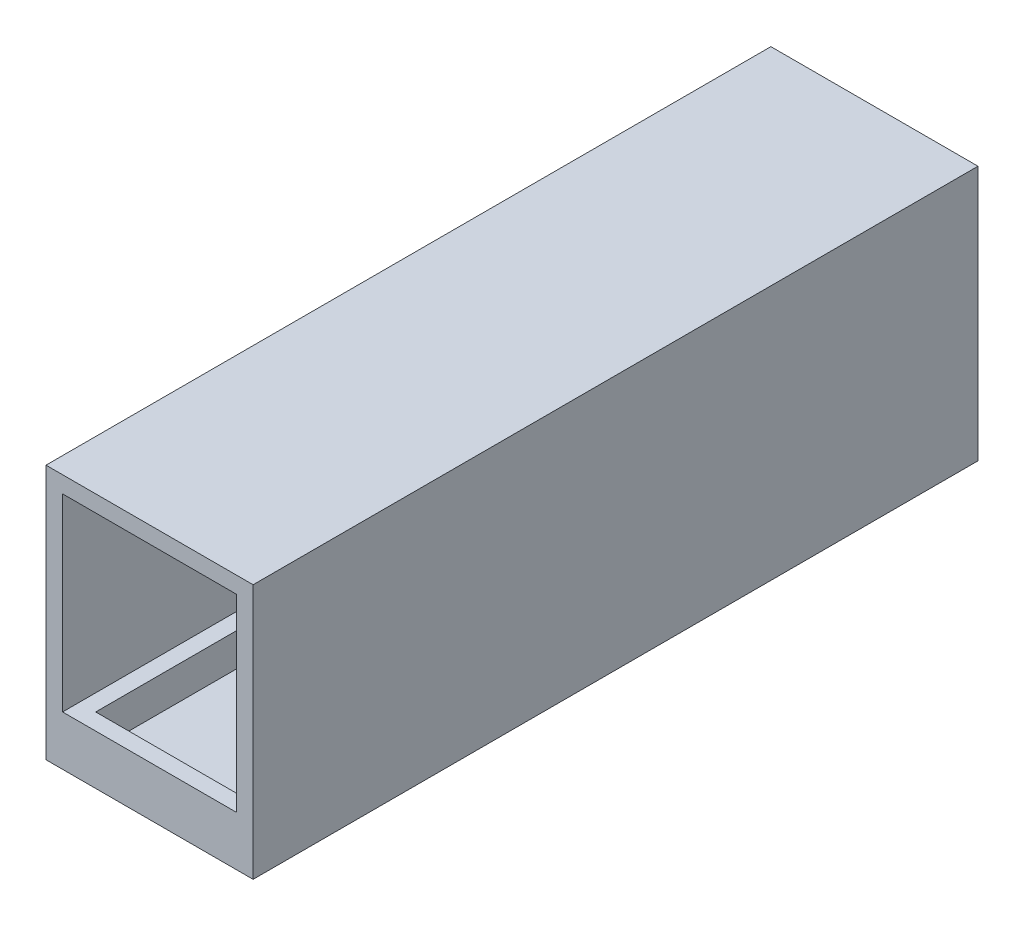
ISO-10303-21;
HEADER;
FILE_DESCRIPTION(('STEP AP214'),'2;1');
FILE_NAME('part.step','',(''),(''),'','','');
FILE_SCHEMA(('AUTOMOTIVE_DESIGN { 1 0 10303 214 1 1 1 1 }'));
ENDSEC;
DATA;
#1=APPLICATION_CONTEXT('core data for automotive mechanical design processes');
#2=APPLICATION_PROTOCOL_DEFINITION('international standard','automotive_design',2000,#1);
#3=PRODUCT_CONTEXT('',#1,'mechanical');
#4=PRODUCT('Part','Part','',(#3));
#5=PRODUCT_RELATED_PRODUCT_CATEGORY('part','',(#4));
#6=PRODUCT_DEFINITION_FORMATION('','',#4);
#7=PRODUCT_DEFINITION_CONTEXT('part definition',#1,'design');
#8=PRODUCT_DEFINITION('design','',#6,#7);
#9=PRODUCT_DEFINITION_SHAPE('','',#8);
#10=(LENGTH_UNIT() NAMED_UNIT(*) SI_UNIT(.MILLI.,.METRE.));
#11=(NAMED_UNIT(*) PLANE_ANGLE_UNIT() SI_UNIT($,.RADIAN.));
#12=(NAMED_UNIT(*) SI_UNIT($,.STERADIAN.) SOLID_ANGLE_UNIT());
#13=UNCERTAINTY_MEASURE_WITH_UNIT(LENGTH_MEASURE(1.E-05),#10,'distance_accuracy_value','');
#14=(GEOMETRIC_REPRESENTATION_CONTEXT(3) GLOBAL_UNCERTAINTY_ASSIGNED_CONTEXT((#13)) GLOBAL_UNIT_ASSIGNED_CONTEXT((#10,
#11,#12)) REPRESENTATION_CONTEXT('',''));
#15=CARTESIAN_POINT('',(0.,0.,0.));
#16=DIRECTION('',(0.,0.,1.));
#17=DIRECTION('',(1.,0.,0.));
#18=AXIS2_PLACEMENT_3D('',#15,#16,#17);
#19=CARTESIAN_POINT('',(0.,12.7,-188.9125));
#20=DIRECTION('',(0.,0.,-1.));
#21=DIRECTION('',(-1.,0.,0.));
#22=AXIS2_PLACEMENT_3D('',#19,#20,#21);
#23=PLANE('',#22);
#24=DIRECTION('',(0.,1.,0.));
#25=VECTOR('',#24,1.);
#26=CARTESIAN_POINT('',(39.6875,-6.34999999999999,-188.9125));
#27=LINE('',#26,#25);
#28=CARTESIAN_POINT('',(39.6875,-6.34999999999999,-188.9125));
#29=VERTEX_POINT('',#28);
#30=CARTESIAN_POINT('',(39.6875,91.44,-188.9125));
#31=VERTEX_POINT('',#30);
#32=EDGE_CURVE('E219',#29,#31,#27,.T.);
#33=ORIENTED_EDGE('',*,*,#32,.F.);
#34=DIRECTION('',(1.,0.,0.));
#35=VECTOR('',#34,1.);
#36=CARTESIAN_POINT('',(-33.3375,-6.35,-188.9125));
#37=LINE('',#36,#35);
#38=CARTESIAN_POINT('',(-39.6875,-6.35,-188.9125));
#39=VERTEX_POINT('',#38);
#40=EDGE_CURVE('E155',#39,#29,#37,.T.);
#41=ORIENTED_EDGE('',*,*,#40,.F.);
#42=DIRECTION('',(0.,-1.,0.));
#43=VECTOR('',#42,1.);
#44=CARTESIAN_POINT('',(-39.6875,-6.35,-188.9125));
#45=LINE('',#44,#43);
#46=CARTESIAN_POINT('',(-39.6875,91.44,-188.9125));
#47=VERTEX_POINT('',#46);
#48=EDGE_CURVE('E227',#47,#39,#45,.T.);
#49=ORIENTED_EDGE('',*,*,#48,.F.);
#50=DIRECTION('',(-1.,0.,0.));
#51=VECTOR('',#50,1.);
#52=CARTESIAN_POINT('',(-39.6875,91.44,-188.9125));
#53=LINE('',#52,#51);
#54=EDGE_CURVE('E223',#31,#47,#53,.T.);
#55=ORIENTED_EDGE('',*,*,#54,.F.);
#56=EDGE_LOOP('',(#33,#41,#49,#55));
#57=FACE_BOUND('',#56,.T.);
#58=DIRECTION('',(1.,0.,0.));
#59=VECTOR('',#58,1.);
#60=CARTESIAN_POINT('',(0.,12.7,-188.9125));
#61=LINE('',#60,#59);
#62=CARTESIAN_POINT('',(-33.3375,12.7,-188.9125));
#63=VERTEX_POINT('',#62);
#64=CARTESIAN_POINT('',(33.3375,12.7,-188.9125));
#65=VERTEX_POINT('',#64);
#66=EDGE_CURVE('E143',#63,#65,#61,.T.);
#67=ORIENTED_EDGE('',*,*,#66,.T.);
#68=DIRECTION('',(0.,-1.,0.));
#69=VECTOR('',#68,1.);
#70=CARTESIAN_POINT('',(33.3375,85.09,-188.9125));
#71=LINE('',#70,#69);
#72=CARTESIAN_POINT('',(33.3375,85.09,-188.9125));
#73=VERTEX_POINT('',#72);
#74=EDGE_CURVE('E215',#73,#65,#71,.T.);
#75=ORIENTED_EDGE('',*,*,#74,.F.);
#76=DIRECTION('',(1.,0.,0.));
#77=VECTOR('',#76,1.);
#78=CARTESIAN_POINT('',(-33.3375,85.09,-188.9125));
#79=LINE('',#78,#77);
#80=CARTESIAN_POINT('',(-33.3375,85.09,-188.9125));
#81=VERTEX_POINT('',#80);
#82=EDGE_CURVE('E210',#81,#73,#79,.T.);
#83=ORIENTED_EDGE('',*,*,#82,.F.);
#84=DIRECTION('',(0.,1.,0.));
#85=VECTOR('',#84,1.);
#86=CARTESIAN_POINT('',(-33.3375,-6.35,-188.9125));
#87=LINE('',#86,#85);
#88=EDGE_CURVE('E211',#63,#81,#87,.T.);
#89=ORIENTED_EDGE('',*,*,#88,.F.);
#90=EDGE_LOOP('',(#67,#75,#83,#89));
#91=FACE_BOUND('',#90,.T.);
#92=ADVANCED_FACE('F33',(#57,#91),#23,.T.);
#93=CARTESIAN_POINT('',(26.9875,12.7,0.));
#94=DIRECTION('',(-1.,0.,0.));
#95=DIRECTION('',(0.,0.,1.));
#96=AXIS2_PLACEMENT_3D('',#93,#94,#95);
#97=PLANE('',#96);
#98=DIRECTION('',(0.,0.,-1.));
#99=VECTOR('',#98,1.);
#100=CARTESIAN_POINT('',(26.9875,0.,0.));
#101=LINE('',#100,#99);
#102=CARTESIAN_POINT('',(26.9875,0.,-88.9));
#103=VERTEX_POINT('',#102);
#104=CARTESIAN_POINT('',(26.9875,0.,-182.5625));
#105=VERTEX_POINT('',#104);
#106=EDGE_CURVE('E163',#103,#105,#101,.T.);
#107=ORIENTED_EDGE('',*,*,#106,.F.);
#108=DIRECTION('',(0.,-1.,0.));
#109=VECTOR('',#108,1.);
#110=CARTESIAN_POINT('',(26.9875,12.7,-88.9));
#111=LINE('',#110,#109);
#112=CARTESIAN_POINT('',(26.9875,12.7,-88.9));
#113=VERTEX_POINT('',#112);
#114=EDGE_CURVE('E11',#113,#103,#111,.T.);
#115=ORIENTED_EDGE('',*,*,#114,.F.);
#116=DIRECTION('',(0.,0.,-1.));
#117=VECTOR('',#116,1.);
#118=CARTESIAN_POINT('',(26.9875,12.7,0.));
#119=LINE('',#118,#117);
#120=CARTESIAN_POINT('',(26.9875,12.7,-182.5625));
#121=VERTEX_POINT('',#120);
#122=EDGE_CURVE('E120',#113,#121,#119,.T.);
#123=ORIENTED_EDGE('',*,*,#122,.T.);
#124=DIRECTION('',(0.,-1.,0.));
#125=VECTOR('',#124,1.);
#126=CARTESIAN_POINT('',(26.9875,12.7,-182.5625));
#127=LINE('',#126,#125);
#128=EDGE_CURVE('E85',#121,#105,#127,.T.);
#129=ORIENTED_EDGE('',*,*,#128,.T.);
#130=EDGE_LOOP('',(#107,#115,#123,#129));
#131=FACE_BOUND('',#130,.T.);
#132=ADVANCED_FACE('F131',(#131),#97,.T.);
#133=CARTESIAN_POINT('',(0.,12.7,-88.9));
#134=DIRECTION('',(0.,0.,-1.));
#135=DIRECTION('',(-1.,0.,0.));
#136=AXIS2_PLACEMENT_3D('',#133,#134,#135);
#137=PLANE('',#136);
#138=DIRECTION('',(1.,0.,0.));
#139=VECTOR('',#138,1.);
#140=CARTESIAN_POINT('',(0.,0.,-88.9));
#141=LINE('',#140,#139);
#142=CARTESIAN_POINT('',(-26.9875,0.,-88.9));
#143=VERTEX_POINT('',#142);
#144=EDGE_CURVE('E165',#143,#103,#141,.T.);
#145=ORIENTED_EDGE('',*,*,#144,.F.);
#146=DIRECTION('',(0.,-1.,0.));
#147=VECTOR('',#146,1.);
#148=CARTESIAN_POINT('',(-26.9875,12.7,-88.9));
#149=LINE('',#148,#147);
#150=CARTESIAN_POINT('',(-26.9875,12.7,-88.9));
#151=VERTEX_POINT('',#150);
#152=EDGE_CURVE('E43',#151,#143,#149,.T.);
#153=ORIENTED_EDGE('',*,*,#152,.F.);
#154=DIRECTION('',(1.,0.,0.));
#155=VECTOR('',#154,1.);
#156=CARTESIAN_POINT('',(0.,12.7,-88.9));
#157=LINE('',#156,#155);
#158=EDGE_CURVE('E132',#151,#113,#157,.T.);
#159=ORIENTED_EDGE('',*,*,#158,.T.);
#160=ORIENTED_EDGE('',*,*,#114,.T.);
#161=EDGE_LOOP('',(#145,#153,#159,#160));
#162=FACE_BOUND('',#161,.T.);
#163=ADVANCED_FACE('F337',(#162),#137,.T.);
#164=CARTESIAN_POINT('',(-26.9875,12.7,0.));
#165=DIRECTION('',(-1.,0.,0.));
#166=DIRECTION('',(0.,0.,1.));
#167=AXIS2_PLACEMENT_3D('',#164,#165,#166);
#168=PLANE('',#167);
#169=DIRECTION('',(0.,0.,-1.));
#170=VECTOR('',#169,1.);
#171=CARTESIAN_POINT('',(-26.9875,0.,0.));
#172=LINE('',#171,#170);
#173=CARTESIAN_POINT('',(-26.9875,0.,-182.5625));
#174=VERTEX_POINT('',#173);
#175=EDGE_CURVE('E168',#143,#174,#172,.T.);
#176=ORIENTED_EDGE('',*,*,#175,.T.);
#177=DIRECTION('',(0.,-1.,0.));
#178=VECTOR('',#177,1.);
#179=CARTESIAN_POINT('',(-26.9875,12.7,-182.5625));
#180=LINE('',#179,#178);
#181=CARTESIAN_POINT('',(-26.9875,12.7,-182.5625));
#182=VERTEX_POINT('',#181);
#183=EDGE_CURVE('E77',#182,#174,#180,.T.);
#184=ORIENTED_EDGE('',*,*,#183,.F.);
#185=DIRECTION('',(0.,0.,-1.));
#186=VECTOR('',#185,1.);
#187=CARTESIAN_POINT('',(-26.9875,12.7,0.));
#188=LINE('',#187,#186);
#189=EDGE_CURVE('E123',#151,#182,#188,.T.);
#190=ORIENTED_EDGE('',*,*,#189,.F.);
#191=ORIENTED_EDGE('',*,*,#152,.T.);
#192=EDGE_LOOP('',(#176,#184,#190,#191));
#193=FACE_BOUND('',#192,.T.);
#194=ADVANCED_FACE('F341',(#193),#168,.F.);
#195=CARTESIAN_POINT('',(26.9875,12.7,0.));
#196=DIRECTION('',(-1.,0.,0.));
#197=DIRECTION('',(0.,0.,1.));
#198=AXIS2_PLACEMENT_3D('',#195,#196,#197);
#199=PLANE('',#198);
#200=DIRECTION('',(0.,0.,-1.));
#201=VECTOR('',#200,1.);
#202=CARTESIAN_POINT('',(26.9875,0.,0.));
#203=LINE('',#202,#201);
#204=CARTESIAN_POINT('',(26.9875,0.,82.55));
#205=VERTEX_POINT('',#204);
#206=CARTESIAN_POINT('',(26.9875,0.,-82.55));
#207=VERTEX_POINT('',#206);
#208=EDGE_CURVE('E151',#205,#207,#203,.T.);
#209=ORIENTED_EDGE('',*,*,#208,.F.);
#210=DIRECTION('',(0.,-1.,0.));
#211=VECTOR('',#210,1.);
#212=CARTESIAN_POINT('',(26.9875,12.7,82.55));
#213=LINE('',#212,#211);
#214=CARTESIAN_POINT('',(26.9875,12.7,82.55));
#215=VERTEX_POINT('',#214);
#216=EDGE_CURVE('E37',#215,#205,#213,.T.);
#217=ORIENTED_EDGE('',*,*,#216,.F.);
#218=DIRECTION('',(0.,0.,-1.));
#219=VECTOR('',#218,1.);
#220=CARTESIAN_POINT('',(26.9875,12.7,0.));
#221=LINE('',#220,#219);
#222=CARTESIAN_POINT('',(26.9875,12.7,-82.55));
#223=VERTEX_POINT('',#222);
#224=EDGE_CURVE('E170',#215,#223,#221,.T.);
#225=ORIENTED_EDGE('',*,*,#224,.T.);
#226=DIRECTION('',(0.,-1.,0.));
#227=VECTOR('',#226,1.);
#228=CARTESIAN_POINT('',(26.9875,12.7,-82.55));
#229=LINE('',#228,#227);
#230=EDGE_CURVE('E150',#223,#207,#229,.T.);
#231=ORIENTED_EDGE('',*,*,#230,.T.);
#232=EDGE_LOOP('',(#209,#217,#225,#231));
#233=FACE_BOUND('',#232,.T.);
#234=ADVANCED_FACE('F35',(#233),#199,.T.);
#235=CARTESIAN_POINT('',(0.,12.7,82.55));
#236=DIRECTION('',(0.,0.,-1.));
#237=DIRECTION('',(-1.,0.,0.));
#238=AXIS2_PLACEMENT_3D('',#235,#236,#237);
#239=PLANE('',#238);
#240=DIRECTION('',(1.,0.,0.));
#241=VECTOR('',#240,1.);
#242=CARTESIAN_POINT('',(0.,0.,82.55));
#243=LINE('',#242,#241);
#244=CARTESIAN_POINT('',(-26.9875,0.,82.55));
#245=VERTEX_POINT('',#244);
#246=EDGE_CURVE('E154',#245,#205,#243,.T.);
#247=ORIENTED_EDGE('',*,*,#246,.F.);
#248=DIRECTION('',(0.,-1.,0.));
#249=VECTOR('',#248,1.);
#250=CARTESIAN_POINT('',(-26.9875,12.7,82.55));
#251=LINE('',#250,#249);
#252=CARTESIAN_POINT('',(-26.9875,12.7,82.55));
#253=VERTEX_POINT('',#252);
#254=EDGE_CURVE('E177',#253,#245,#251,.T.);
#255=ORIENTED_EDGE('',*,*,#254,.F.);
#256=DIRECTION('',(1.,0.,0.));
#257=VECTOR('',#256,1.);
#258=CARTESIAN_POINT('',(0.,12.7,82.55));
#259=LINE('',#258,#257);
#260=EDGE_CURVE('E186',#253,#215,#259,.T.);
#261=ORIENTED_EDGE('',*,*,#260,.T.);
#262=ORIENTED_EDGE('',*,*,#216,.T.);
#263=EDGE_LOOP('',(#247,#255,#261,#262));
#264=FACE_BOUND('',#263,.T.);
#265=ADVANCED_FACE('F183',(#264),#239,.T.);
#266=CARTESIAN_POINT('',(-26.9875,12.7,0.));
#267=DIRECTION('',(-1.,0.,0.));
#268=DIRECTION('',(0.,0.,1.));
#269=AXIS2_PLACEMENT_3D('',#266,#267,#268);
#270=PLANE('',#269);
#271=DIRECTION('',(0.,0.,-1.));
#272=VECTOR('',#271,1.);
#273=CARTESIAN_POINT('',(-26.9875,0.,0.));
#274=LINE('',#273,#272);
#275=CARTESIAN_POINT('',(-26.9875,0.,-82.55));
#276=VERTEX_POINT('',#275);
#277=EDGE_CURVE('E158',#245,#276,#274,.T.);
#278=ORIENTED_EDGE('',*,*,#277,.T.);
#279=DIRECTION('',(0.,-1.,0.));
#280=VECTOR('',#279,1.);
#281=CARTESIAN_POINT('',(-26.9875,12.7,-82.55));
#282=LINE('',#281,#280);
#283=CARTESIAN_POINT('',(-26.9875,12.7,-82.55));
#284=VERTEX_POINT('',#283);
#285=EDGE_CURVE('E175',#284,#276,#282,.T.);
#286=ORIENTED_EDGE('',*,*,#285,.F.);
#287=DIRECTION('',(0.,0.,-1.));
#288=VECTOR('',#287,1.);
#289=CARTESIAN_POINT('',(-26.9875,12.7,0.));
#290=LINE('',#289,#288);
#291=EDGE_CURVE('E136',#253,#284,#290,.T.);
#292=ORIENTED_EDGE('',*,*,#291,.F.);
#293=ORIENTED_EDGE('',*,*,#254,.T.);
#294=EDGE_LOOP('',(#278,#286,#292,#293));
#295=FACE_BOUND('',#294,.T.);
#296=ADVANCED_FACE('F192',(#295),#270,.F.);
#297=CARTESIAN_POINT('',(0.,12.7,-182.5625));
#298=DIRECTION('',(0.,0.,-1.));
#299=DIRECTION('',(-1.,0.,0.));
#300=AXIS2_PLACEMENT_3D('',#297,#298,#299);
#301=PLANE('',#300);
#302=DIRECTION('',(1.,0.,0.));
#303=VECTOR('',#302,1.);
#304=CARTESIAN_POINT('',(0.,0.,-182.5625));
#305=LINE('',#304,#303);
#306=EDGE_CURVE('E128',#174,#105,#305,.T.);
#307=ORIENTED_EDGE('',*,*,#306,.T.);
#308=ORIENTED_EDGE('',*,*,#128,.F.);
#309=DIRECTION('',(1.,0.,0.));
#310=VECTOR('',#309,1.);
#311=CARTESIAN_POINT('',(0.,12.7,-182.5625));
#312=LINE('',#311,#310);
#313=EDGE_CURVE('E116',#182,#121,#312,.T.);
#314=ORIENTED_EDGE('',*,*,#313,.F.);
#315=ORIENTED_EDGE('',*,*,#183,.T.);
#316=EDGE_LOOP('',(#307,#308,#314,#315));
#317=FACE_BOUND('',#316,.T.);
#318=ADVANCED_FACE('F126',(#317),#301,.F.);
#319=CARTESIAN_POINT('',(0.,12.7,-82.55));
#320=DIRECTION('',(0.,0.,-1.));
#321=DIRECTION('',(-1.,0.,0.));
#322=AXIS2_PLACEMENT_3D('',#319,#320,#321);
#323=PLANE('',#322);
#324=DIRECTION('',(1.,0.,0.));
#325=VECTOR('',#324,1.);
#326=CARTESIAN_POINT('',(0.,0.,-82.55));
#327=LINE('',#326,#325);
#328=EDGE_CURVE('E160',#276,#207,#327,.T.);
#329=ORIENTED_EDGE('',*,*,#328,.T.);
#330=ORIENTED_EDGE('',*,*,#230,.F.);
#331=DIRECTION('',(1.,0.,0.));
#332=VECTOR('',#331,1.);
#333=CARTESIAN_POINT('',(0.,12.7,-82.55));
#334=LINE('',#333,#332);
#335=EDGE_CURVE('E133',#284,#223,#334,.T.);
#336=ORIENTED_EDGE('',*,*,#335,.F.);
#337=ORIENTED_EDGE('',*,*,#285,.T.);
#338=EDGE_LOOP('',(#329,#330,#336,#337));
#339=FACE_BOUND('',#338,.T.);
#340=ADVANCED_FACE('F195',(#339),#323,.F.);
#341=CARTESIAN_POINT('',(0.,12.7,88.9));
#342=DIRECTION('',(0.,0.,-1.));
#343=DIRECTION('',(-1.,0.,0.));
#344=AXIS2_PLACEMENT_3D('',#341,#342,#343);
#345=PLANE('',#344);
#346=DIRECTION('',(0.,-1.,0.));
#347=VECTOR('',#346,1.);
#348=CARTESIAN_POINT('',(-39.6875,-6.35,88.9));
#349=LINE('',#348,#347);
#350=CARTESIAN_POINT('',(-39.6875,91.44,88.9));
#351=VERTEX_POINT('',#350);
#352=CARTESIAN_POINT('',(-39.6875,-6.35,88.9));
#353=VERTEX_POINT('',#352);
#354=EDGE_CURVE('E242',#351,#353,#349,.T.);
#355=ORIENTED_EDGE('',*,*,#354,.T.);
#356=DIRECTION('',(1.,0.,0.));
#357=VECTOR('',#356,1.);
#358=CARTESIAN_POINT('',(-33.3375,-6.35,88.9));
#359=LINE('',#358,#357);
#360=CARTESIAN_POINT('',(39.6875,-6.34999999999999,88.9));
#361=VERTEX_POINT('',#360);
#362=EDGE_CURVE('E203',#353,#361,#359,.T.);
#363=ORIENTED_EDGE('',*,*,#362,.T.);
#364=DIRECTION('',(0.,1.,0.));
#365=VECTOR('',#364,1.);
#366=CARTESIAN_POINT('',(39.6875,-6.34999999999999,88.9));
#367=LINE('',#366,#365);
#368=CARTESIAN_POINT('',(39.6875,91.44,88.9));
#369=VERTEX_POINT('',#368);
#370=EDGE_CURVE('E251',#361,#369,#367,.T.);
#371=ORIENTED_EDGE('',*,*,#370,.T.);
#372=DIRECTION('',(-1.,0.,0.));
#373=VECTOR('',#372,1.);
#374=CARTESIAN_POINT('',(-39.6875,91.44,88.9));
#375=LINE('',#374,#373);
#376=EDGE_CURVE('E254',#369,#351,#375,.T.);
#377=ORIENTED_EDGE('',*,*,#376,.T.);
#378=EDGE_LOOP('',(#355,#363,#371,#377));
#379=FACE_BOUND('',#378,.T.);
#380=DIRECTION('',(1.,0.,0.));
#381=VECTOR('',#380,1.);
#382=CARTESIAN_POINT('',(0.,12.7,88.9));
#383=LINE('',#382,#381);
#384=CARTESIAN_POINT('',(-33.3375,12.7,88.9));
#385=VERTEX_POINT('',#384);
#386=CARTESIAN_POINT('',(33.3375,12.7,88.9));
#387=VERTEX_POINT('',#386);
#388=EDGE_CURVE('E52',#385,#387,#383,.T.);
#389=ORIENTED_EDGE('',*,*,#388,.F.);
#390=DIRECTION('',(0.,1.,0.));
#391=VECTOR('',#390,1.);
#392=CARTESIAN_POINT('',(-33.3375,-6.35,88.9));
#393=LINE('',#392,#391);
#394=CARTESIAN_POINT('',(-33.3375,85.09,88.9));
#395=VERTEX_POINT('',#394);
#396=EDGE_CURVE('E243',#385,#395,#393,.T.);
#397=ORIENTED_EDGE('',*,*,#396,.T.);
#398=DIRECTION('',(1.,0.,0.));
#399=VECTOR('',#398,1.);
#400=CARTESIAN_POINT('',(-33.3375,85.09,88.9));
#401=LINE('',#400,#399);
#402=CARTESIAN_POINT('',(33.3375,85.09,88.9));
#403=VERTEX_POINT('',#402);
#404=EDGE_CURVE('E245',#395,#403,#401,.T.);
#405=ORIENTED_EDGE('',*,*,#404,.T.);
#406=DIRECTION('',(0.,-1.,0.));
#407=VECTOR('',#406,1.);
#408=CARTESIAN_POINT('',(33.3375,85.09,88.9));
#409=LINE('',#408,#407);
#410=EDGE_CURVE('E249',#403,#387,#409,.T.);
#411=ORIENTED_EDGE('',*,*,#410,.T.);
#412=EDGE_LOOP('',(#389,#397,#405,#411));
#413=FACE_BOUND('',#412,.T.);
#414=ADVANCED_FACE('F303',(#379,#413),#345,.F.);
#415=CARTESIAN_POINT('',(0.,12.7,0.));
#416=DIRECTION('',(0.,1.,0.));
#417=DIRECTION('',(0.,0.,1.));
#418=AXIS2_PLACEMENT_3D('',#415,#416,#417);
#419=PLANE('',#418);
#420=ORIENTED_EDGE('',*,*,#224,.F.);
#421=ORIENTED_EDGE('',*,*,#260,.F.);
#422=ORIENTED_EDGE('',*,*,#291,.T.);
#423=ORIENTED_EDGE('',*,*,#335,.T.);
#424=EDGE_LOOP('',(#420,#421,#422,#423));
#425=FACE_BOUND('',#424,.T.);
#426=ORIENTED_EDGE('',*,*,#122,.F.);
#427=ORIENTED_EDGE('',*,*,#158,.F.);
#428=ORIENTED_EDGE('',*,*,#189,.T.);
#429=ORIENTED_EDGE('',*,*,#313,.T.);
#430=EDGE_LOOP('',(#426,#427,#428,#429));
#431=FACE_BOUND('',#430,.T.);
#432=DIRECTION('',(0.,0.,-1.));
#433=VECTOR('',#432,1.);
#434=CARTESIAN_POINT('',(33.3375,12.7,0.));
#435=LINE('',#434,#433);
#436=EDGE_CURVE('E124',#387,#65,#435,.T.);
#437=ORIENTED_EDGE('',*,*,#436,.T.);
#438=ORIENTED_EDGE('',*,*,#66,.F.);
#439=DIRECTION('',(0.,0.,-1.));
#440=VECTOR('',#439,1.);
#441=CARTESIAN_POINT('',(-33.3375,12.7,0.));
#442=LINE('',#441,#440);
#443=EDGE_CURVE('E146',#385,#63,#442,.T.);
#444=ORIENTED_EDGE('',*,*,#443,.F.);
#445=ORIENTED_EDGE('',*,*,#388,.T.);
#446=EDGE_LOOP('',(#437,#438,#444,#445));
#447=FACE_BOUND('',#446,.T.);
#448=ADVANCED_FACE('F117',(#425,#431,#447),#419,.T.);
#449=CARTESIAN_POINT('',(-33.3375,0.,-255.889198373389));
#450=DIRECTION('',(0.,1.,0.));
#451=DIRECTION('',(0.,0.,1.));
#452=AXIS2_PLACEMENT_3D('',#449,#450,#451);
#453=PLANE('',#452);
#454=ORIENTED_EDGE('',*,*,#144,.T.);
#455=ORIENTED_EDGE('',*,*,#106,.T.);
#456=ORIENTED_EDGE('',*,*,#306,.F.);
#457=ORIENTED_EDGE('',*,*,#175,.F.);
#458=EDGE_LOOP('',(#454,#455,#456,#457));
#459=FACE_BOUND('',#458,.T.);
#460=ADVANCED_FACE('F339',(#459),#453,.T.);
#461=ORIENTED_EDGE('',*,*,#246,.T.);
#462=ORIENTED_EDGE('',*,*,#208,.T.);
#463=ORIENTED_EDGE('',*,*,#328,.F.);
#464=ORIENTED_EDGE('',*,*,#277,.F.);
#465=EDGE_LOOP('',(#461,#462,#463,#464));
#466=FACE_BOUND('',#465,.T.);
#467=ADVANCED_FACE('F189',(#466),#453,.T.);
#468=CARTESIAN_POINT('',(-33.3375,-6.35,-255.889198373389));
#469=DIRECTION('',(0.,-1.,0.));
#470=DIRECTION('',(0.,0.,-1.));
#471=AXIS2_PLACEMENT_3D('',#468,#469,#470);
#472=PLANE('',#471);
#473=CARTESIAN_POINT('',(-33.3375,-6.35,-182.5625));
#474=DIRECTION('',(0.,-1.,0.));
#475=DIRECTION('',(0.,0.,-1.));
#476=AXIS2_PLACEMENT_3D('',#473,#474,#475);
#477=CIRCLE('',#476,3.175);
#478=CARTESIAN_POINT('',(-33.3375,-6.35,-185.7375));
#479=VERTEX_POINT('',#478);
#480=EDGE_CURVE('E265',#479,#479,#477,.T.);
#481=ORIENTED_EDGE('',*,*,#480,.F.);
#482=EDGE_LOOP('',(#481));
#483=FACE_BOUND('',#482,.T.);
#484=CARTESIAN_POINT('',(33.3375,-6.35,-182.5625));
#485=DIRECTION('',(0.,-1.,0.));
#486=DIRECTION('',(0.,0.,1.));
#487=AXIS2_PLACEMENT_3D('',#484,#485,#486);
#488=CIRCLE('',#487,3.175);
#489=CARTESIAN_POINT('',(33.3375,-6.35,-179.3875));
#490=VERTEX_POINT('',#489);
#491=EDGE_CURVE('E259',#490,#490,#488,.T.);
#492=ORIENTED_EDGE('',*,*,#491,.F.);
#493=EDGE_LOOP('',(#492));
#494=FACE_BOUND('',#493,.T.);
#495=ORIENTED_EDGE('',*,*,#362,.F.);
#496=DIRECTION('',(0.,0.,1.));
#497=VECTOR('',#496,1.);
#498=CARTESIAN_POINT('',(-39.6875,-6.35,-314.86199275404));
#499=LINE('',#498,#497);
#500=EDGE_CURVE('E206',#39,#353,#499,.T.);
#501=ORIENTED_EDGE('',*,*,#500,.F.);
#502=ORIENTED_EDGE('',*,*,#40,.T.);
#503=DIRECTION('',(0.,0.,1.));
#504=VECTOR('',#503,1.);
#505=CARTESIAN_POINT('',(39.6875,-6.34999999999999,-314.86199275404));
#506=LINE('',#505,#504);
#507=EDGE_CURVE('E216',#29,#361,#506,.T.);
#508=ORIENTED_EDGE('',*,*,#507,.T.);
#509=EDGE_LOOP('',(#495,#501,#502,#508));
#510=FACE_BOUND('',#509,.T.);
#511=ADVANCED_FACE('F280',(#483,#494,#510),#472,.T.);
#512=CARTESIAN_POINT('',(-33.3375,-6.35,-314.86199275404));
#513=DIRECTION('',(1.,0.,0.));
#514=DIRECTION('',(0.,0.,-1.));
#515=AXIS2_PLACEMENT_3D('',#512,#513,#514);
#516=PLANE('',#515);
#517=ORIENTED_EDGE('',*,*,#396,.F.);
#518=ORIENTED_EDGE('',*,*,#443,.T.);
#519=ORIENTED_EDGE('',*,*,#88,.T.);
#520=DIRECTION('',(0.,0.,1.));
#521=VECTOR('',#520,1.);
#522=CARTESIAN_POINT('',(-33.3375,85.09,-314.86199275404));
#523=LINE('',#522,#521);
#524=EDGE_CURVE('E207',#81,#395,#523,.T.);
#525=ORIENTED_EDGE('',*,*,#524,.T.);
#526=EDGE_LOOP('',(#517,#518,#519,#525));
#527=FACE_BOUND('',#526,.T.);
#528=ADVANCED_FACE('F283',(#527),#516,.T.);
#529=CARTESIAN_POINT('',(-33.3375,85.09,-314.86199275404));
#530=DIRECTION('',(0.,-1.,0.));
#531=DIRECTION('',(0.,0.,-1.));
#532=AXIS2_PLACEMENT_3D('',#529,#530,#531);
#533=PLANE('',#532);
#534=ORIENTED_EDGE('',*,*,#524,.F.);
#535=ORIENTED_EDGE('',*,*,#82,.T.);
#536=DIRECTION('',(0.,0.,1.));
#537=VECTOR('',#536,1.);
#538=CARTESIAN_POINT('',(33.3375,85.09,-314.86199275404));
#539=LINE('',#538,#537);
#540=EDGE_CURVE('E212',#73,#403,#539,.T.);
#541=ORIENTED_EDGE('',*,*,#540,.T.);
#542=ORIENTED_EDGE('',*,*,#404,.F.);
#543=EDGE_LOOP('',(#534,#535,#541,#542));
#544=FACE_BOUND('',#543,.T.);
#545=ADVANCED_FACE('F456',(#544),#533,.T.);
#546=CARTESIAN_POINT('',(33.3375,85.09,-314.86199275404));
#547=DIRECTION('',(-1.,0.,0.));
#548=DIRECTION('',(0.,-1.,0.));
#549=AXIS2_PLACEMENT_3D('',#546,#547,#548);
#550=PLANE('',#549);
#551=ORIENTED_EDGE('',*,*,#74,.T.);
#552=ORIENTED_EDGE('',*,*,#436,.F.);
#553=ORIENTED_EDGE('',*,*,#410,.F.);
#554=ORIENTED_EDGE('',*,*,#540,.F.);
#555=EDGE_LOOP('',(#551,#552,#553,#554));
#556=FACE_BOUND('',#555,.T.);
#557=ADVANCED_FACE('F466',(#556),#550,.T.);
#558=CARTESIAN_POINT('',(39.6875,-6.34999999999999,-314.86199275404));
#559=DIRECTION('',(1.,0.,0.));
#560=DIRECTION('',(0.,1.,0.));
#561=AXIS2_PLACEMENT_3D('',#558,#559,#560);
#562=PLANE('',#561);
#563=ORIENTED_EDGE('',*,*,#507,.F.);
#564=ORIENTED_EDGE('',*,*,#32,.T.);
#565=DIRECTION('',(0.,0.,1.));
#566=VECTOR('',#565,1.);
#567=CARTESIAN_POINT('',(39.6875,91.44,-314.86199275404));
#568=LINE('',#567,#566);
#569=EDGE_CURVE('E220',#31,#369,#568,.T.);
#570=ORIENTED_EDGE('',*,*,#569,.T.);
#571=ORIENTED_EDGE('',*,*,#370,.F.);
#572=EDGE_LOOP('',(#563,#564,#570,#571));
#573=FACE_BOUND('',#572,.T.);
#574=ADVANCED_FACE('F475',(#573),#562,.T.);
#575=CARTESIAN_POINT('',(-39.6875,91.44,-314.86199275404));
#576=DIRECTION('',(0.,1.,0.));
#577=DIRECTION('',(-1.,0.,0.));
#578=AXIS2_PLACEMENT_3D('',#575,#576,#577);
#579=PLANE('',#578);
#580=ORIENTED_EDGE('',*,*,#569,.F.);
#581=ORIENTED_EDGE('',*,*,#54,.T.);
#582=DIRECTION('',(0.,0.,1.));
#583=VECTOR('',#582,1.);
#584=CARTESIAN_POINT('',(-39.6875,91.44,-314.86199275404));
#585=LINE('',#584,#583);
#586=EDGE_CURVE('E224',#47,#351,#585,.T.);
#587=ORIENTED_EDGE('',*,*,#586,.T.);
#588=ORIENTED_EDGE('',*,*,#376,.F.);
#589=EDGE_LOOP('',(#580,#581,#587,#588));
#590=FACE_BOUND('',#589,.T.);
#591=ADVANCED_FACE('F309',(#590),#579,.T.);
#592=CARTESIAN_POINT('',(-39.6875,-6.35,-314.86199275404));
#593=DIRECTION('',(-1.,0.,0.));
#594=DIRECTION('',(0.,0.,1.));
#595=AXIS2_PLACEMENT_3D('',#592,#593,#594);
#596=PLANE('',#595);
#597=ORIENTED_EDGE('',*,*,#586,.F.);
#598=ORIENTED_EDGE('',*,*,#48,.T.);
#599=ORIENTED_EDGE('',*,*,#500,.T.);
#600=ORIENTED_EDGE('',*,*,#354,.F.);
#601=EDGE_LOOP('',(#597,#598,#599,#600));
#602=FACE_BOUND('',#601,.T.);
#603=ADVANCED_FACE('F301',(#602),#596,.T.);
#604=CARTESIAN_POINT('',(33.3375,0.,-182.5625));
#605=DIRECTION('',(0.,-1.,0.));
#606=DIRECTION('',(0.,0.,-1.));
#607=AXIS2_PLACEMENT_3D('',#604,#605,#606);
#608=CYLINDRICAL_SURFACE('',#607,3.175);
#609=CARTESIAN_POINT('',(33.3375,0.,-182.5625));
#610=DIRECTION('',(0.,-1.,0.));
#611=DIRECTION('',(0.,0.,1.));
#612=AXIS2_PLACEMENT_3D('',#609,#610,#611);
#613=CIRCLE('',#612,3.175);
#614=CARTESIAN_POINT('',(33.3375,0.,-179.3875));
#615=VERTEX_POINT('',#614);
#616=EDGE_CURVE('E262',#615,#615,#613,.T.);
#617=ORIENTED_EDGE('',*,*,#616,.F.);
#618=EDGE_LOOP('',(#617));
#619=FACE_BOUND('',#618,.T.);
#620=ORIENTED_EDGE('',*,*,#491,.T.);
#621=EDGE_LOOP('',(#620));
#622=FACE_BOUND('',#621,.T.);
#623=ADVANCED_FACE('F498',(#619,#622),#608,.F.);
#624=CARTESIAN_POINT('',(33.3375,0.,-182.5625));
#625=DIRECTION('',(0.,1.,0.));
#626=DIRECTION('',(0.,0.,1.));
#627=AXIS2_PLACEMENT_3D('',#624,#625,#626);
#628=PLANE('',#627);
#629=ORIENTED_EDGE('',*,*,#616,.T.);
#630=EDGE_LOOP('',(#629));
#631=FACE_BOUND('',#630,.T.);
#632=ADVANCED_FACE('F276',(#631),#628,.F.);
#633=CARTESIAN_POINT('',(-33.3375,0.,-182.5625));
#634=DIRECTION('',(0.,-1.,0.));
#635=DIRECTION('',(0.,0.,-1.));
#636=AXIS2_PLACEMENT_3D('',#633,#634,#635);
#637=CYLINDRICAL_SURFACE('',#636,3.175);
#638=CARTESIAN_POINT('',(-33.3375,0.,-182.5625));
#639=DIRECTION('',(0.,-1.,0.));
#640=DIRECTION('',(0.,0.,-1.));
#641=AXIS2_PLACEMENT_3D('',#638,#639,#640);
#642=CIRCLE('',#641,3.175);
#643=CARTESIAN_POINT('',(-33.3375,0.,-185.7375));
#644=VERTEX_POINT('',#643);
#645=EDGE_CURVE('E246',#644,#644,#642,.T.);
#646=ORIENTED_EDGE('',*,*,#645,.F.);
#647=EDGE_LOOP('',(#646));
#648=FACE_BOUND('',#647,.T.);
#649=ORIENTED_EDGE('',*,*,#480,.T.);
#650=EDGE_LOOP('',(#649));
#651=FACE_BOUND('',#650,.T.);
#652=ADVANCED_FACE('F273',(#648,#651),#637,.F.);
#653=CARTESIAN_POINT('',(-33.3375,0.,-182.5625));
#654=DIRECTION('',(0.,-1.,0.));
#655=DIRECTION('',(0.,0.,-1.));
#656=AXIS2_PLACEMENT_3D('',#653,#654,#655);
#657=PLANE('',#656);
#658=ORIENTED_EDGE('',*,*,#645,.T.);
#659=EDGE_LOOP('',(#658));
#660=FACE_BOUND('',#659,.T.);
#661=ADVANCED_FACE('F271',(#660),#657,.T.);
#662=CLOSED_SHELL('',(#92,#132,#163,#194,#234,#265,#296,#318,#340,#414,#448,#460,#467,#511,#528,
#545,#557,#574,#591,#603,#623,#632,#652,#661));
#663=MANIFOLD_SOLID_BREP('B2',#662);
#664=ADVANCED_BREP_SHAPE_REPRESENTATION('',(#18,#663),#14);
#665=SHAPE_DEFINITION_REPRESENTATION(#9,#664);
ENDSEC;
END-ISO-10303-21;
